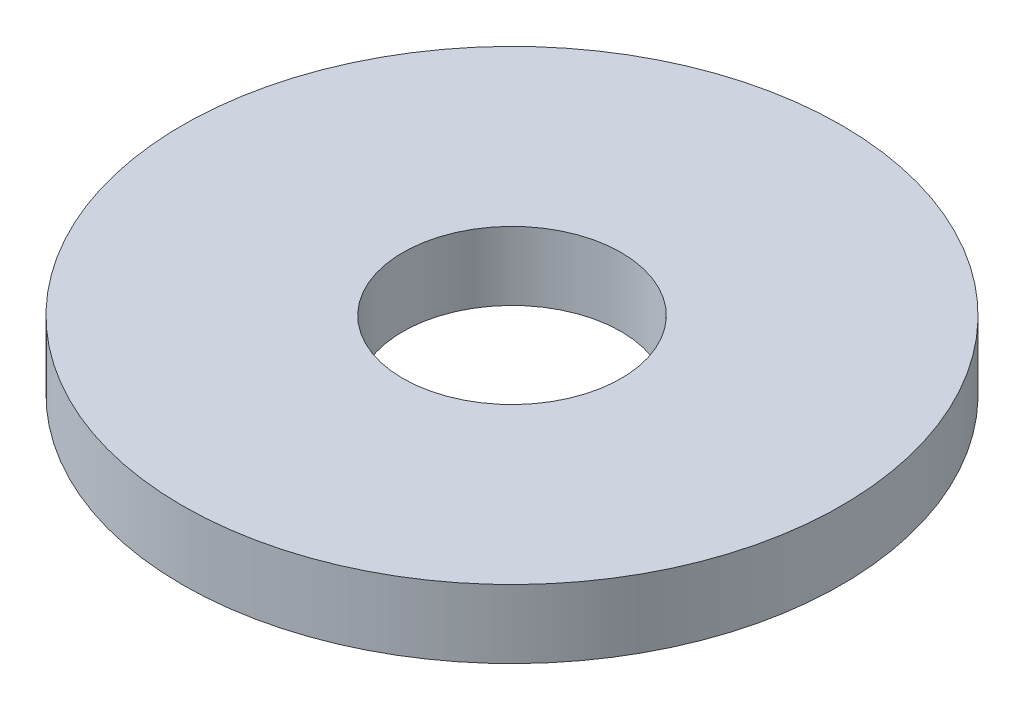
ISO-10303-21;
HEADER;
FILE_DESCRIPTION(('STEP AP214'),'2;1');
FILE_NAME('part.step','',(''),(''),'','','');
FILE_SCHEMA(('AUTOMOTIVE_DESIGN { 1 0 10303 214 1 1 1 1 }'));
ENDSEC;
DATA;
#1=APPLICATION_CONTEXT('core data for automotive mechanical design processes');
#2=APPLICATION_PROTOCOL_DEFINITION('international standard','automotive_design',2000,#1);
#3=PRODUCT_CONTEXT('',#1,'mechanical');
#4=PRODUCT('Part','Part','',(#3));
#5=PRODUCT_RELATED_PRODUCT_CATEGORY('part','',(#4));
#6=PRODUCT_DEFINITION_FORMATION('','',#4);
#7=PRODUCT_DEFINITION_CONTEXT('part definition',#1,'design');
#8=PRODUCT_DEFINITION('design','',#6,#7);
#9=PRODUCT_DEFINITION_SHAPE('','',#8);
#10=(LENGTH_UNIT() NAMED_UNIT(*) SI_UNIT(.MILLI.,.METRE.));
#11=(NAMED_UNIT(*) PLANE_ANGLE_UNIT() SI_UNIT($,.RADIAN.));
#12=(NAMED_UNIT(*) SI_UNIT($,.STERADIAN.) SOLID_ANGLE_UNIT());
#13=UNCERTAINTY_MEASURE_WITH_UNIT(LENGTH_MEASURE(1.E-05),#10,'distance_accuracy_value','');
#14=(GEOMETRIC_REPRESENTATION_CONTEXT(3) GLOBAL_UNCERTAINTY_ASSIGNED_CONTEXT((#13)) GLOBAL_UNIT_ASSIGNED_CONTEXT((#10,
#11,#12)) REPRESENTATION_CONTEXT('',''));
#15=CARTESIAN_POINT('',(0.,0.,0.));
#16=DIRECTION('',(0.,0.,1.));
#17=DIRECTION('',(1.,0.,0.));
#18=AXIS2_PLACEMENT_3D('',#15,#16,#17);
#19=CARTESIAN_POINT('',(0.,2.032,0.));
#20=DIRECTION('',(0.,1.,0.));
#21=DIRECTION('',(0.,0.,1.));
#22=AXIS2_PLACEMENT_3D('',#19,#20,#21);
#23=PLANE('',#22);
#24=CARTESIAN_POINT('',(0.,2.032,0.));
#25=DIRECTION('',(0.,1.,0.));
#26=DIRECTION('',(0.,0.,1.));
#27=AXIS2_PLACEMENT_3D('',#24,#25,#26);
#28=CIRCLE('',#27,9.779);
#29=CARTESIAN_POINT('',(0.,2.032,9.779));
#30=VERTEX_POINT('',#29);
#31=EDGE_CURVE('E10',#30,#30,#28,.T.);
#32=ORIENTED_EDGE('',*,*,#31,.T.);
#33=EDGE_LOOP('',(#32));
#34=FACE_BOUND('',#33,.T.);
#35=CARTESIAN_POINT('',(0.,2.032,0.));
#36=DIRECTION('',(0.,1.,0.));
#37=DIRECTION('',(0.,0.,1.));
#38=AXIS2_PLACEMENT_3D('',#35,#36,#37);
#39=CIRCLE('',#38,3.2385);
#40=CARTESIAN_POINT('',(0.,2.032,3.2385));
#41=VERTEX_POINT('',#40);
#42=EDGE_CURVE('E56',#41,#41,#39,.T.);
#43=ORIENTED_EDGE('',*,*,#42,.F.);
#44=EDGE_LOOP('',(#43));
#45=FACE_BOUND('',#44,.T.);
#46=ADVANCED_FACE('F43',(#34,#45),#23,.T.);
#47=CARTESIAN_POINT('',(0.,0.,0.));
#48=DIRECTION('',(0.,1.,0.));
#49=DIRECTION('',(0.,0.,1.));
#50=AXIS2_PLACEMENT_3D('',#47,#48,#49);
#51=PLANE('',#50);
#52=CARTESIAN_POINT('',(0.,0.,0.));
#53=DIRECTION('',(0.,1.,0.));
#54=DIRECTION('',(0.,0.,1.));
#55=AXIS2_PLACEMENT_3D('',#52,#53,#54);
#56=CIRCLE('',#55,9.779);
#57=CARTESIAN_POINT('',(0.,0.,9.779));
#58=VERTEX_POINT('',#57);
#59=EDGE_CURVE('E47',#58,#58,#56,.T.);
#60=ORIENTED_EDGE('',*,*,#59,.F.);
#61=EDGE_LOOP('',(#60));
#62=FACE_BOUND('',#61,.T.);
#63=CARTESIAN_POINT('',(0.,0.,0.));
#64=DIRECTION('',(0.,1.,0.));
#65=DIRECTION('',(0.,0.,1.));
#66=AXIS2_PLACEMENT_3D('',#63,#64,#65);
#67=CIRCLE('',#66,3.2385);
#68=CARTESIAN_POINT('',(0.,0.,3.2385));
#69=VERTEX_POINT('',#68);
#70=EDGE_CURVE('E58',#69,#69,#67,.T.);
#71=ORIENTED_EDGE('',*,*,#70,.T.);
#72=EDGE_LOOP('',(#71));
#73=FACE_BOUND('',#72,.T.);
#74=ADVANCED_FACE('F70',(#62,#73),#51,.F.);
#75=CARTESIAN_POINT('',(0.,2.032,0.));
#76=DIRECTION('',(0.,-1.,0.));
#77=DIRECTION('',(0.,0.,-1.));
#78=AXIS2_PLACEMENT_3D('',#75,#76,#77);
#79=CYLINDRICAL_SURFACE('',#78,9.779);
#80=ORIENTED_EDGE('',*,*,#31,.F.);
#81=EDGE_LOOP('',(#80));
#82=FACE_BOUND('',#81,.T.);
#83=ORIENTED_EDGE('',*,*,#59,.T.);
#84=EDGE_LOOP('',(#83));
#85=FACE_BOUND('',#84,.T.);
#86=ADVANCED_FACE('F45',(#82,#85),#79,.T.);
#87=CARTESIAN_POINT('',(0.,2.032,0.));
#88=DIRECTION('',(0.,-1.,0.));
#89=DIRECTION('',(0.,0.,-1.));
#90=AXIS2_PLACEMENT_3D('',#87,#88,#89);
#91=CYLINDRICAL_SURFACE('',#90,3.2385);
#92=ORIENTED_EDGE('',*,*,#42,.T.);
#93=EDGE_LOOP('',(#92));
#94=FACE_BOUND('',#93,.T.);
#95=ORIENTED_EDGE('',*,*,#70,.F.);
#96=EDGE_LOOP('',(#95));
#97=FACE_BOUND('',#96,.T.);
#98=ADVANCED_FACE('F66',(#94,#97),#91,.F.);
#99=CLOSED_SHELL('',(#46,#74,#86,#98));
#100=MANIFOLD_SOLID_BREP('B2',#99);
#101=ADVANCED_BREP_SHAPE_REPRESENTATION('',(#18,#100),#14);
#102=SHAPE_DEFINITION_REPRESENTATION(#9,#101);
ENDSEC;
END-ISO-10303-21;
